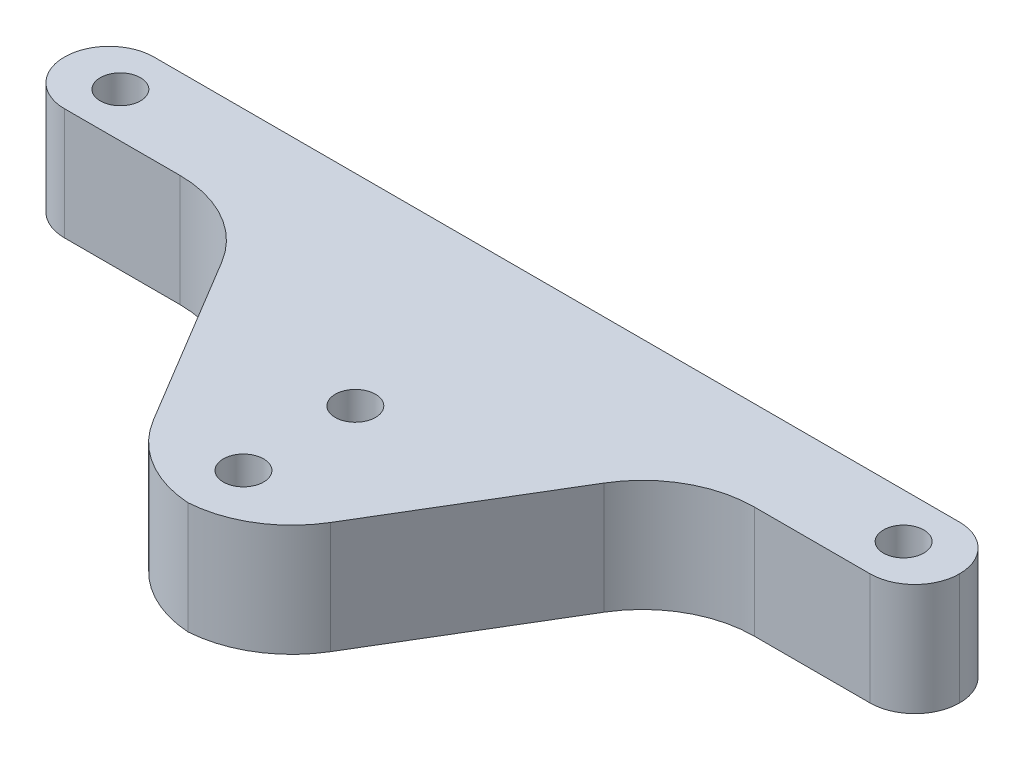
ISO-10303-21;
HEADER;
FILE_DESCRIPTION(('STEP AP214'),'2;1');
FILE_NAME('part.step','',(''),(''),'','','');
FILE_SCHEMA(('AUTOMOTIVE_DESIGN { 1 0 10303 214 1 1 1 1 }'));
ENDSEC;
DATA;
#1=APPLICATION_CONTEXT('core data for automotive mechanical design processes');
#2=APPLICATION_PROTOCOL_DEFINITION('international standard','automotive_design',2000,#1);
#3=PRODUCT_CONTEXT('',#1,'mechanical');
#4=PRODUCT('Part','Part','',(#3));
#5=PRODUCT_RELATED_PRODUCT_CATEGORY('part','',(#4));
#6=PRODUCT_DEFINITION_FORMATION('','',#4);
#7=PRODUCT_DEFINITION_CONTEXT('part definition',#1,'design');
#8=PRODUCT_DEFINITION('design','',#6,#7);
#9=PRODUCT_DEFINITION_SHAPE('','',#8);
#10=(LENGTH_UNIT() NAMED_UNIT(*) SI_UNIT(.MILLI.,.METRE.));
#11=(NAMED_UNIT(*) PLANE_ANGLE_UNIT() SI_UNIT($,.RADIAN.));
#12=(NAMED_UNIT(*) SI_UNIT($,.STERADIAN.) SOLID_ANGLE_UNIT());
#13=UNCERTAINTY_MEASURE_WITH_UNIT(LENGTH_MEASURE(1.E-05),#10,'distance_accuracy_value','');
#14=(GEOMETRIC_REPRESENTATION_CONTEXT(3) GLOBAL_UNCERTAINTY_ASSIGNED_CONTEXT((#13)) GLOBAL_UNIT_ASSIGNED_CONTEXT((#10,
#11,#12)) REPRESENTATION_CONTEXT('',''));
#15=CARTESIAN_POINT('',(0.,0.,0.));
#16=DIRECTION('',(0.,0.,1.));
#17=DIRECTION('',(1.,0.,0.));
#18=AXIS2_PLACEMENT_3D('',#15,#16,#17);
#19=CARTESIAN_POINT('',(0.,12.7,0.));
#20=DIRECTION('',(0.,1.,0.));
#21=DIRECTION('',(0.,0.,1.));
#22=AXIS2_PLACEMENT_3D('',#19,#20,#21);
#23=PLANE('',#22);
#24=CARTESIAN_POINT('',(44.45,12.7,-36.83));
#25=DIRECTION('',(0.,1.,0.));
#26=DIRECTION('',(0.,0.,1.));
#27=AXIS2_PLACEMENT_3D('',#24,#25,#26);
#28=CIRCLE('',#27,2.28599999999999);
#29=CARTESIAN_POINT('',(44.45,12.7,-34.544));
#30=VERTEX_POINT('',#29);
#31=EDGE_CURVE('E492',#30,#30,#28,.T.);
#32=ORIENTED_EDGE('',*,*,#31,.F.);
#33=EDGE_LOOP('',(#32));
#34=FACE_BOUND('',#33,.T.);
#35=CARTESIAN_POINT('',(0.,12.7,-19.05));
#36=DIRECTION('',(0.,1.,0.));
#37=DIRECTION('',(0.,0.,1.));
#38=AXIS2_PLACEMENT_3D('',#35,#36,#37);
#39=CIRCLE('',#38,2.286);
#40=CARTESIAN_POINT('',(0.,12.7,-16.764));
#41=VERTEX_POINT('',#40);
#42=EDGE_CURVE('E271',#41,#41,#39,.T.);
#43=ORIENTED_EDGE('',*,*,#42,.F.);
#44=EDGE_LOOP('',(#43));
#45=FACE_BOUND('',#44,.T.);
#46=DIRECTION('',(0.514495755427526,0.,0.857492925712544));
#47=VECTOR('',#46,1.);
#48=CARTESIAN_POINT('',(-6.35,12.7,0.));
#49=LINE('',#48,#47);
#50=CARTESIAN_POINT('',(-21.7004576563577,12.7,-25.5840960939296));
#51=VERTEX_POINT('',#50);
#52=CARTESIAN_POINT('',(-10.0495423436422,12.7,-6.16590390607043));
#53=VERTEX_POINT('',#52);
#54=EDGE_CURVE('E187',#51,#53,#49,.T.);
#55=ORIENTED_EDGE('',*,*,#54,.T.);
#56=CARTESIAN_POINT('',(0.840617812907077,12.7,-12.7));
#57=DIRECTION('',(0.,1.,0.));
#58=DIRECTION('',(0.,0.,1.));
#59=AXIS2_PLACEMENT_3D('',#56,#57,#58);
#60=CIRCLE('',#59,12.7);
#61=CARTESIAN_POINT('',(0.,12.7,-0.0278509441917086));
#62=VERTEX_POINT('',#61);
#63=EDGE_CURVE('E59',#53,#62,#60,.T.);
#64=ORIENTED_EDGE('',*,*,#63,.T.);
#65=CARTESIAN_POINT('',(-0.840617812907058,12.7,-12.7));
#66=DIRECTION('',(0.,1.,0.));
#67=DIRECTION('',(0.,0.,1.));
#68=AXIS2_PLACEMENT_3D('',#65,#66,#67);
#69=CIRCLE('',#68,12.7);
#70=CARTESIAN_POINT('',(10.0495423436423,12.7,-6.16590390607044));
#71=VERTEX_POINT('',#70);
#72=EDGE_CURVE('E237',#62,#71,#69,.T.);
#73=ORIENTED_EDGE('',*,*,#72,.T.);
#74=DIRECTION('',(0.514495755427526,0.,-0.857492925712544));
#75=VECTOR('',#74,1.);
#76=CARTESIAN_POINT('',(6.35,12.7,0.));
#77=LINE('',#76,#75);
#78=CARTESIAN_POINT('',(21.7004576563577,12.7,-25.5840960939296));
#79=VERTEX_POINT('',#78);
#80=EDGE_CURVE('E185',#71,#79,#77,.T.);
#81=ORIENTED_EDGE('',*,*,#80,.T.);
#82=CARTESIAN_POINT('',(32.5906178129071,12.7,-19.05));
#83=DIRECTION('',(0.,1.,0.));
#84=DIRECTION('',(0.,0.,1.));
#85=AXIS2_PLACEMENT_3D('',#82,#83,#84);
#86=CIRCLE('',#85,12.7);
#87=CARTESIAN_POINT('',(32.5906178129071,12.7,-31.75));
#88=VERTEX_POINT('',#87);
#89=EDGE_CURVE('E11',#79,#88,#86,.F.);
#90=ORIENTED_EDGE('',*,*,#89,.T.);
#91=DIRECTION('',(1.,0.,0.));
#92=VECTOR('',#91,1.);
#93=CARTESIAN_POINT('',(25.4,12.7,-31.75));
#94=LINE('',#93,#92);
#95=CARTESIAN_POINT('',(45.72,12.7,-31.75));
#96=VERTEX_POINT('',#95);
#97=EDGE_CURVE('E274',#88,#96,#94,.T.);
#98=ORIENTED_EDGE('',*,*,#97,.T.);
#99=CARTESIAN_POINT('',(45.72,12.7,-36.83));
#100=DIRECTION('',(0.,1.,0.));
#101=DIRECTION('',(0.,0.,1.));
#102=AXIS2_PLACEMENT_3D('',#99,#100,#101);
#103=CIRCLE('',#102,5.08);
#104=CARTESIAN_POINT('',(50.8,12.7,-36.83));
#105=VERTEX_POINT('',#104);
#106=EDGE_CURVE('E200',#96,#105,#103,.T.);
#107=ORIENTED_EDGE('',*,*,#106,.T.);
#108=CARTESIAN_POINT('',(45.72,12.7,-36.83));
#109=DIRECTION('',(0.,1.,0.));
#110=DIRECTION('',(0.,0.,1.));
#111=AXIS2_PLACEMENT_3D('',#108,#109,#110);
#112=CIRCLE('',#111,5.08);
#113=CARTESIAN_POINT('',(45.72,12.7,-41.91));
#114=VERTEX_POINT('',#113);
#115=EDGE_CURVE('E203',#105,#114,#112,.T.);
#116=ORIENTED_EDGE('',*,*,#115,.T.);
#117=DIRECTION('',(-1.,0.,0.));
#118=VECTOR('',#117,1.);
#119=CARTESIAN_POINT('',(50.8,12.7,-41.91));
#120=LINE('',#119,#118);
#121=CARTESIAN_POINT('',(-45.72,12.7,-41.91));
#122=VERTEX_POINT('',#121);
#123=EDGE_CURVE('E160',#114,#122,#120,.T.);
#124=ORIENTED_EDGE('',*,*,#123,.T.);
#125=CARTESIAN_POINT('',(-45.72,12.7,-36.83));
#126=DIRECTION('',(0.,1.,0.));
#127=DIRECTION('',(0.,0.,1.));
#128=AXIS2_PLACEMENT_3D('',#125,#126,#127);
#129=CIRCLE('',#128,5.08);
#130=CARTESIAN_POINT('',(-50.8,12.7,-36.83));
#131=VERTEX_POINT('',#130);
#132=EDGE_CURVE('E197',#122,#131,#129,.T.);
#133=ORIENTED_EDGE('',*,*,#132,.T.);
#134=CARTESIAN_POINT('',(-45.72,12.7,-36.83));
#135=DIRECTION('',(0.,1.,0.));
#136=DIRECTION('',(0.,0.,1.));
#137=AXIS2_PLACEMENT_3D('',#134,#135,#136);
#138=CIRCLE('',#137,5.08);
#139=CARTESIAN_POINT('',(-45.72,12.7,-31.75));
#140=VERTEX_POINT('',#139);
#141=EDGE_CURVE('E149',#131,#140,#138,.T.);
#142=ORIENTED_EDGE('',*,*,#141,.T.);
#143=DIRECTION('',(1.,0.,0.));
#144=VECTOR('',#143,1.);
#145=CARTESIAN_POINT('',(-25.4,12.7,-31.75));
#146=LINE('',#145,#144);
#147=CARTESIAN_POINT('',(-32.5906178129071,12.7,-31.75));
#148=VERTEX_POINT('',#147);
#149=EDGE_CURVE('E281',#140,#148,#146,.T.);
#150=ORIENTED_EDGE('',*,*,#149,.T.);
#151=CARTESIAN_POINT('',(-32.590617812907,12.7,-19.05));
#152=DIRECTION('',(0.,1.,0.));
#153=DIRECTION('',(0.,0.,1.));
#154=AXIS2_PLACEMENT_3D('',#151,#152,#153);
#155=CIRCLE('',#154,12.7);
#156=EDGE_CURVE('E255',#148,#51,#155,.F.);
#157=ORIENTED_EDGE('',*,*,#156,.T.);
#158=EDGE_LOOP('',(#55,#64,#73,#81,#90,#98,#107,#116,#124,#133,#142,#150,#157));
#159=FACE_BOUND('',#158,.T.);
#160=CARTESIAN_POINT('',(0.,12.7,-6.35000000000003));
#161=DIRECTION('',(0.,1.,0.));
#162=DIRECTION('',(0.,0.,1.));
#163=AXIS2_PLACEMENT_3D('',#160,#161,#162);
#164=CIRCLE('',#163,2.286);
#165=CARTESIAN_POINT('',(0.,12.7,-4.06400000000003));
#166=VERTEX_POINT('',#165);
#167=EDGE_CURVE('E500',#166,#166,#164,.T.);
#168=ORIENTED_EDGE('',*,*,#167,.F.);
#169=EDGE_LOOP('',(#168));
#170=FACE_BOUND('',#169,.T.);
#171=CARTESIAN_POINT('',(-44.45,12.7,-36.83));
#172=DIRECTION('',(0.,1.,0.));
#173=DIRECTION('',(0.,0.,-1.));
#174=AXIS2_PLACEMENT_3D('',#171,#172,#173);
#175=CIRCLE('',#174,2.28599999999999);
#176=CARTESIAN_POINT('',(-44.45,12.7,-39.116));
#177=VERTEX_POINT('',#176);
#178=EDGE_CURVE('E484',#177,#177,#175,.T.);
#179=ORIENTED_EDGE('',*,*,#178,.F.);
#180=EDGE_LOOP('',(#179));
#181=FACE_BOUND('',#180,.T.);
#182=ADVANCED_FACE('F42',(#34,#45,#159,#170,#181),#23,.T.);
#183=CARTESIAN_POINT('',(0.,0.,0.));
#184=DIRECTION('',(0.,1.,0.));
#185=DIRECTION('',(0.,0.,1.));
#186=AXIS2_PLACEMENT_3D('',#183,#184,#185);
#187=PLANE('',#186);
#188=CARTESIAN_POINT('',(-0.840617812907058,0.,-12.7));
#189=DIRECTION('',(0.,1.,0.));
#190=DIRECTION('',(0.,0.,1.));
#191=AXIS2_PLACEMENT_3D('',#188,#189,#190);
#192=CIRCLE('',#191,12.7);
#193=CARTESIAN_POINT('',(10.0495423436423,0.,-6.16590390607044));
#194=VERTEX_POINT('',#193);
#195=CARTESIAN_POINT('',(0.,0.,-0.0278509441917086));
#196=VERTEX_POINT('',#195);
#197=EDGE_CURVE('E231',#194,#196,#192,.F.);
#198=ORIENTED_EDGE('',*,*,#197,.T.);
#199=CARTESIAN_POINT('',(0.840617812907077,0.,-12.7));
#200=DIRECTION('',(0.,1.,0.));
#201=DIRECTION('',(0.,0.,1.));
#202=AXIS2_PLACEMENT_3D('',#199,#200,#201);
#203=CIRCLE('',#202,12.7);
#204=CARTESIAN_POINT('',(-10.0495423436422,0.,-6.16590390607043));
#205=VERTEX_POINT('',#204);
#206=EDGE_CURVE('E234',#196,#205,#203,.F.);
#207=ORIENTED_EDGE('',*,*,#206,.T.);
#208=DIRECTION('',(0.514495755427526,0.,0.857492925712544));
#209=VECTOR('',#208,1.);
#210=CARTESIAN_POINT('',(-6.35,0.,0.));
#211=LINE('',#210,#209);
#212=CARTESIAN_POINT('',(-21.7004576563577,0.,-25.5840960939296));
#213=VERTEX_POINT('',#212);
#214=EDGE_CURVE('E176',#213,#205,#211,.T.);
#215=ORIENTED_EDGE('',*,*,#214,.F.);
#216=CARTESIAN_POINT('',(-32.590617812907,0.,-19.05));
#217=DIRECTION('',(0.,1.,0.));
#218=DIRECTION('',(0.,0.,1.));
#219=AXIS2_PLACEMENT_3D('',#216,#217,#218);
#220=CIRCLE('',#219,12.7);
#221=CARTESIAN_POINT('',(-32.5906178129071,0.,-31.75));
#222=VERTEX_POINT('',#221);
#223=EDGE_CURVE('E252',#213,#222,#220,.T.);
#224=ORIENTED_EDGE('',*,*,#223,.T.);
#225=DIRECTION('',(1.,0.,0.));
#226=VECTOR('',#225,1.);
#227=CARTESIAN_POINT('',(-25.4,0.,-31.75));
#228=LINE('',#227,#226);
#229=CARTESIAN_POINT('',(-45.72,0.,-31.75));
#230=VERTEX_POINT('',#229);
#231=EDGE_CURVE('E170',#230,#222,#228,.T.);
#232=ORIENTED_EDGE('',*,*,#231,.F.);
#233=CARTESIAN_POINT('',(-45.72,0.,-36.83));
#234=DIRECTION('',(0.,1.,0.));
#235=DIRECTION('',(0.,0.,1.));
#236=AXIS2_PLACEMENT_3D('',#233,#234,#235);
#237=CIRCLE('',#236,5.08);
#238=CARTESIAN_POINT('',(-50.8,0.,-36.83));
#239=VERTEX_POINT('',#238);
#240=EDGE_CURVE('E162',#230,#239,#237,.F.);
#241=ORIENTED_EDGE('',*,*,#240,.T.);
#242=CARTESIAN_POINT('',(-45.72,0.,-36.83));
#243=DIRECTION('',(0.,1.,0.));
#244=DIRECTION('',(0.,0.,1.));
#245=AXIS2_PLACEMENT_3D('',#242,#243,#244);
#246=CIRCLE('',#245,5.08);
#247=CARTESIAN_POINT('',(-45.72,0.,-41.91));
#248=VERTEX_POINT('',#247);
#249=EDGE_CURVE('E168',#239,#248,#246,.F.);
#250=ORIENTED_EDGE('',*,*,#249,.T.);
#251=DIRECTION('',(-1.,0.,0.));
#252=VECTOR('',#251,1.);
#253=CARTESIAN_POINT('',(50.8,0.,-41.91));
#254=LINE('',#253,#252);
#255=CARTESIAN_POINT('',(45.72,0.,-41.91));
#256=VERTEX_POINT('',#255);
#257=EDGE_CURVE('E157',#256,#248,#254,.T.);
#258=ORIENTED_EDGE('',*,*,#257,.F.);
#259=CARTESIAN_POINT('',(45.72,0.,-36.83));
#260=DIRECTION('',(0.,1.,0.));
#261=DIRECTION('',(0.,0.,1.));
#262=AXIS2_PLACEMENT_3D('',#259,#260,#261);
#263=CIRCLE('',#262,5.08);
#264=CARTESIAN_POINT('',(50.8,0.,-36.83));
#265=VERTEX_POINT('',#264);
#266=EDGE_CURVE('E137',#256,#265,#263,.F.);
#267=ORIENTED_EDGE('',*,*,#266,.T.);
#268=CARTESIAN_POINT('',(45.72,0.,-36.83));
#269=DIRECTION('',(0.,1.,0.));
#270=DIRECTION('',(0.,0.,1.));
#271=AXIS2_PLACEMENT_3D('',#268,#269,#270);
#272=CIRCLE('',#271,5.08);
#273=CARTESIAN_POINT('',(45.72,0.,-31.75));
#274=VERTEX_POINT('',#273);
#275=EDGE_CURVE('E150',#265,#274,#272,.F.);
#276=ORIENTED_EDGE('',*,*,#275,.T.);
#277=DIRECTION('',(1.,0.,0.));
#278=VECTOR('',#277,1.);
#279=CARTESIAN_POINT('',(25.4,0.,-31.75));
#280=LINE('',#279,#278);
#281=CARTESIAN_POINT('',(32.5906178129071,0.,-31.75));
#282=VERTEX_POINT('',#281);
#283=EDGE_CURVE('E171',#282,#274,#280,.T.);
#284=ORIENTED_EDGE('',*,*,#283,.F.);
#285=CARTESIAN_POINT('',(32.5906178129071,0.,-19.05));
#286=DIRECTION('',(0.,1.,0.));
#287=DIRECTION('',(0.,0.,1.));
#288=AXIS2_PLACEMENT_3D('',#285,#286,#287);
#289=CIRCLE('',#288,12.7);
#290=CARTESIAN_POINT('',(21.7004576563577,0.,-25.5840960939296));
#291=VERTEX_POINT('',#290);
#292=EDGE_CURVE('E52',#282,#291,#289,.T.);
#293=ORIENTED_EDGE('',*,*,#292,.T.);
#294=DIRECTION('',(0.514495755427526,0.,-0.857492925712544));
#295=VECTOR('',#294,1.);
#296=CARTESIAN_POINT('',(6.35,0.,0.));
#297=LINE('',#296,#295);
#298=EDGE_CURVE('E178',#194,#291,#297,.T.);
#299=ORIENTED_EDGE('',*,*,#298,.F.);
#300=EDGE_LOOP('',(#198,#207,#215,#224,#232,#241,#250,#258,#267,#276,#284,#293,#299));
#301=FACE_BOUND('',#300,.T.);
#302=CARTESIAN_POINT('',(0.,0.,-19.05));
#303=DIRECTION('',(0.,1.,0.));
#304=DIRECTION('',(0.,0.,1.));
#305=AXIS2_PLACEMENT_3D('',#302,#303,#304);
#306=CIRCLE('',#305,2.286);
#307=CARTESIAN_POINT('',(0.,0.,-16.764));
#308=VERTEX_POINT('',#307);
#309=EDGE_CURVE('E504',#308,#308,#306,.T.);
#310=ORIENTED_EDGE('',*,*,#309,.T.);
#311=EDGE_LOOP('',(#310));
#312=FACE_BOUND('',#311,.T.);
#313=CARTESIAN_POINT('',(0.,0.,-6.35000000000003));
#314=DIRECTION('',(0.,1.,0.));
#315=DIRECTION('',(0.,0.,1.));
#316=AXIS2_PLACEMENT_3D('',#313,#314,#315);
#317=CIRCLE('',#316,2.286);
#318=CARTESIAN_POINT('',(0.,0.,-4.06400000000003));
#319=VERTEX_POINT('',#318);
#320=EDGE_CURVE('E496',#319,#319,#317,.T.);
#321=ORIENTED_EDGE('',*,*,#320,.T.);
#322=EDGE_LOOP('',(#321));
#323=FACE_BOUND('',#322,.T.);
#324=CARTESIAN_POINT('',(44.45,0.,-36.83));
#325=DIRECTION('',(0.,1.,0.));
#326=DIRECTION('',(0.,0.,1.));
#327=AXIS2_PLACEMENT_3D('',#324,#325,#326);
#328=CIRCLE('',#327,2.28599999999999);
#329=CARTESIAN_POINT('',(44.45,0.,-34.544));
#330=VERTEX_POINT('',#329);
#331=EDGE_CURVE('E488',#330,#330,#328,.T.);
#332=ORIENTED_EDGE('',*,*,#331,.T.);
#333=EDGE_LOOP('',(#332));
#334=FACE_BOUND('',#333,.T.);
#335=CARTESIAN_POINT('',(-44.45,0.,-36.83));
#336=DIRECTION('',(0.,1.,0.));
#337=DIRECTION('',(0.,0.,-1.));
#338=AXIS2_PLACEMENT_3D('',#335,#336,#337);
#339=CIRCLE('',#338,2.28599999999999);
#340=CARTESIAN_POINT('',(-44.45,0.,-39.116));
#341=VERTEX_POINT('',#340);
#342=EDGE_CURVE('E216',#341,#341,#339,.T.);
#343=ORIENTED_EDGE('',*,*,#342,.T.);
#344=EDGE_LOOP('',(#343));
#345=FACE_BOUND('',#344,.T.);
#346=ADVANCED_FACE('F165',(#301,#312,#323,#334,#345),#187,.F.);
#347=CARTESIAN_POINT('',(6.35,12.7,0.));
#348=DIRECTION('',(-0.857492925712544,0.,-0.514495755427526));
#349=DIRECTION('',(-0.514495755427526,0.,0.857492925712545));
#350=AXIS2_PLACEMENT_3D('',#347,#348,#349);
#351=PLANE('',#350);
#352=ORIENTED_EDGE('',*,*,#80,.F.);
#353=DIRECTION('',(0.,-1.,0.));
#354=VECTOR('',#353,1.);
#355=CARTESIAN_POINT('',(10.0495423436423,12.7,-6.16590390607044));
#356=LINE('',#355,#354);
#357=EDGE_CURVE('E245',#71,#194,#356,.T.);
#358=ORIENTED_EDGE('',*,*,#357,.T.);
#359=ORIENTED_EDGE('',*,*,#298,.T.);
#360=DIRECTION('',(0.,-1.,0.));
#361=VECTOR('',#360,1.);
#362=CARTESIAN_POINT('',(21.7004576563577,12.7,-25.5840960939296));
#363=LINE('',#362,#361);
#364=EDGE_CURVE('E242',#291,#79,#363,.F.);
#365=ORIENTED_EDGE('',*,*,#364,.T.);
#366=EDGE_LOOP('',(#352,#358,#359,#365));
#367=FACE_BOUND('',#366,.T.);
#368=ADVANCED_FACE('F268',(#367),#351,.F.);
#369=CARTESIAN_POINT('',(25.4,12.7,-31.75));
#370=DIRECTION('',(0.,0.,-1.));
#371=DIRECTION('',(-1.,0.,0.));
#372=AXIS2_PLACEMENT_3D('',#369,#370,#371);
#373=PLANE('',#372);
#374=ORIENTED_EDGE('',*,*,#97,.F.);
#375=DIRECTION('',(0.,-1.,0.));
#376=VECTOR('',#375,1.);
#377=CARTESIAN_POINT('',(32.5906178129071,0.,-31.75));
#378=LINE('',#377,#376);
#379=EDGE_CURVE('E248',#88,#282,#378,.T.);
#380=ORIENTED_EDGE('',*,*,#379,.T.);
#381=ORIENTED_EDGE('',*,*,#283,.T.);
#382=DIRECTION('',(0.,-1.,0.));
#383=VECTOR('',#382,1.);
#384=CARTESIAN_POINT('',(45.72,12.7,-31.75));
#385=LINE('',#384,#383);
#386=EDGE_CURVE('E206',#274,#96,#385,.F.);
#387=ORIENTED_EDGE('',*,*,#386,.T.);
#388=EDGE_LOOP('',(#374,#380,#381,#387));
#389=FACE_BOUND('',#388,.T.);
#390=ADVANCED_FACE('F273',(#389),#373,.F.);
#391=CARTESIAN_POINT('',(50.8,12.7,-41.91));
#392=DIRECTION('',(0.,0.,1.));
#393=DIRECTION('',(1.,0.,0.));
#394=AXIS2_PLACEMENT_3D('',#391,#392,#393);
#395=PLANE('',#394);
#396=ORIENTED_EDGE('',*,*,#123,.F.);
#397=DIRECTION('',(0.,-1.,0.));
#398=VECTOR('',#397,1.);
#399=CARTESIAN_POINT('',(45.72,12.7,-41.91));
#400=LINE('',#399,#398);
#401=EDGE_CURVE('E141',#114,#256,#400,.T.);
#402=ORIENTED_EDGE('',*,*,#401,.T.);
#403=ORIENTED_EDGE('',*,*,#257,.T.);
#404=DIRECTION('',(0.,-1.,0.));
#405=VECTOR('',#404,1.);
#406=CARTESIAN_POINT('',(-45.72,12.7,-41.91));
#407=LINE('',#406,#405);
#408=EDGE_CURVE('E163',#248,#122,#407,.F.);
#409=ORIENTED_EDGE('',*,*,#408,.T.);
#410=EDGE_LOOP('',(#396,#402,#403,#409));
#411=FACE_BOUND('',#410,.T.);
#412=ADVANCED_FACE('F155',(#411),#395,.F.);
#413=CARTESIAN_POINT('',(-25.4,12.7,-31.75));
#414=DIRECTION('',(0.,0.,-1.));
#415=DIRECTION('',(-1.,0.,0.));
#416=AXIS2_PLACEMENT_3D('',#413,#414,#415);
#417=PLANE('',#416);
#418=ORIENTED_EDGE('',*,*,#231,.T.);
#419=DIRECTION('',(0.,-1.,0.));
#420=VECTOR('',#419,1.);
#421=CARTESIAN_POINT('',(-32.5906178129071,12.7,-31.75));
#422=LINE('',#421,#420);
#423=EDGE_CURVE('E228',#222,#148,#422,.F.);
#424=ORIENTED_EDGE('',*,*,#423,.T.);
#425=ORIENTED_EDGE('',*,*,#149,.F.);
#426=DIRECTION('',(0.,-1.,0.));
#427=VECTOR('',#426,1.);
#428=CARTESIAN_POINT('',(-45.72,12.7,-31.75));
#429=LINE('',#428,#427);
#430=EDGE_CURVE('E210',#140,#230,#429,.T.);
#431=ORIENTED_EDGE('',*,*,#430,.T.);
#432=EDGE_LOOP('',(#418,#424,#425,#431));
#433=FACE_BOUND('',#432,.T.);
#434=ADVANCED_FACE('F304',(#433),#417,.F.);
#435=CARTESIAN_POINT('',(-6.35,12.7,0.));
#436=DIRECTION('',(0.857492925712544,0.,-0.514495755427526));
#437=DIRECTION('',(-0.514495755427526,0.,-0.857492925712544));
#438=AXIS2_PLACEMENT_3D('',#435,#436,#437);
#439=PLANE('',#438);
#440=ORIENTED_EDGE('',*,*,#54,.F.);
#441=DIRECTION('',(0.,-1.,0.));
#442=VECTOR('',#441,1.);
#443=CARTESIAN_POINT('',(-21.7004576563577,0.,-25.5840960939296));
#444=LINE('',#443,#442);
#445=EDGE_CURVE('E224',#51,#213,#444,.T.);
#446=ORIENTED_EDGE('',*,*,#445,.T.);
#447=ORIENTED_EDGE('',*,*,#214,.T.);
#448=DIRECTION('',(0.,-1.,0.));
#449=VECTOR('',#448,1.);
#450=CARTESIAN_POINT('',(-10.0495423436422,12.7,-6.16590390607043));
#451=LINE('',#450,#449);
#452=EDGE_CURVE('E213',#205,#53,#451,.F.);
#453=ORIENTED_EDGE('',*,*,#452,.T.);
#454=EDGE_LOOP('',(#440,#446,#447,#453));
#455=FACE_BOUND('',#454,.T.);
#456=ADVANCED_FACE('F295',(#455),#439,.F.);
#457=CARTESIAN_POINT('',(0.,12.7,-19.05));
#458=DIRECTION('',(0.,-1.,0.));
#459=DIRECTION('',(0.,0.,-1.));
#460=AXIS2_PLACEMENT_3D('',#457,#458,#459);
#461=CYLINDRICAL_SURFACE('',#460,2.286);
#462=ORIENTED_EDGE('',*,*,#42,.T.);
#463=EDGE_LOOP('',(#462));
#464=FACE_BOUND('',#463,.T.);
#465=ORIENTED_EDGE('',*,*,#309,.F.);
#466=EDGE_LOOP('',(#465));
#467=FACE_BOUND('',#466,.T.);
#468=ADVANCED_FACE('F337',(#464,#467),#461,.F.);
#469=CARTESIAN_POINT('',(0.,12.7,-6.35000000000003));
#470=DIRECTION('',(0.,-1.,0.));
#471=DIRECTION('',(0.,0.,-1.));
#472=AXIS2_PLACEMENT_3D('',#469,#470,#471);
#473=CYLINDRICAL_SURFACE('',#472,2.286);
#474=ORIENTED_EDGE('',*,*,#167,.T.);
#475=EDGE_LOOP('',(#474));
#476=FACE_BOUND('',#475,.T.);
#477=ORIENTED_EDGE('',*,*,#320,.F.);
#478=EDGE_LOOP('',(#477));
#479=FACE_BOUND('',#478,.T.);
#480=ADVANCED_FACE('F377',(#476,#479),#473,.F.);
#481=CARTESIAN_POINT('',(44.45,12.7,-36.83));
#482=DIRECTION('',(0.,-1.,0.));
#483=DIRECTION('',(0.,0.,-1.));
#484=AXIS2_PLACEMENT_3D('',#481,#482,#483);
#485=CYLINDRICAL_SURFACE('',#484,2.28599999999999);
#486=ORIENTED_EDGE('',*,*,#31,.T.);
#487=EDGE_LOOP('',(#486));
#488=FACE_BOUND('',#487,.T.);
#489=ORIENTED_EDGE('',*,*,#331,.F.);
#490=EDGE_LOOP('',(#489));
#491=FACE_BOUND('',#490,.T.);
#492=ADVANCED_FACE('F323',(#488,#491),#485,.F.);
#493=CARTESIAN_POINT('',(-44.45,12.7,-36.83));
#494=DIRECTION('',(0.,-1.,0.));
#495=DIRECTION('',(0.,0.,-1.));
#496=AXIS2_PLACEMENT_3D('',#493,#494,#495);
#497=CYLINDRICAL_SURFACE('',#496,2.28599999999999);
#498=ORIENTED_EDGE('',*,*,#178,.T.);
#499=EDGE_LOOP('',(#498));
#500=FACE_BOUND('',#499,.T.);
#501=ORIENTED_EDGE('',*,*,#342,.F.);
#502=EDGE_LOOP('',(#501));
#503=FACE_BOUND('',#502,.T.);
#504=ADVANCED_FACE('F316',(#500,#503),#497,.F.);
#505=CARTESIAN_POINT('',(45.72,12.7,-36.83));
#506=DIRECTION('',(0.,-1.,0.));
#507=DIRECTION('',(0.,0.,-1.));
#508=AXIS2_PLACEMENT_3D('',#505,#506,#507);
#509=CYLINDRICAL_SURFACE('',#508,5.08);
#510=DIRECTION('',(0.,-1.,0.));
#511=VECTOR('',#510,1.);
#512=CARTESIAN_POINT('',(50.8,12.7,-36.83));
#513=LINE('',#512,#511);
#514=EDGE_CURVE('E143',#105,#265,#513,.T.);
#515=ORIENTED_EDGE('',*,*,#514,.F.);
#516=ORIENTED_EDGE('',*,*,#106,.F.);
#517=ORIENTED_EDGE('',*,*,#386,.F.);
#518=ORIENTED_EDGE('',*,*,#275,.F.);
#519=EDGE_LOOP('',(#515,#516,#517,#518));
#520=FACE_BOUND('',#519,.T.);
#521=ADVANCED_FACE('F314',(#520),#509,.T.);
#522=CARTESIAN_POINT('',(45.72,12.7,-36.83));
#523=DIRECTION('',(0.,-1.,0.));
#524=DIRECTION('',(0.,0.,-1.));
#525=AXIS2_PLACEMENT_3D('',#522,#523,#524);
#526=CYLINDRICAL_SURFACE('',#525,5.08);
#527=ORIENTED_EDGE('',*,*,#115,.F.);
#528=ORIENTED_EDGE('',*,*,#514,.T.);
#529=ORIENTED_EDGE('',*,*,#266,.F.);
#530=ORIENTED_EDGE('',*,*,#401,.F.);
#531=EDGE_LOOP('',(#527,#528,#529,#530));
#532=FACE_BOUND('',#531,.T.);
#533=ADVANCED_FACE('F140',(#532),#526,.T.);
#534=CARTESIAN_POINT('',(-45.72,12.7,-36.83));
#535=DIRECTION('',(0.,-1.,0.));
#536=DIRECTION('',(0.,0.,-1.));
#537=AXIS2_PLACEMENT_3D('',#534,#535,#536);
#538=CYLINDRICAL_SURFACE('',#537,5.08);
#539=ORIENTED_EDGE('',*,*,#430,.F.);
#540=ORIENTED_EDGE('',*,*,#141,.F.);
#541=DIRECTION('',(0.,-1.,0.));
#542=VECTOR('',#541,1.);
#543=CARTESIAN_POINT('',(-50.8,12.7,-36.83));
#544=LINE('',#543,#542);
#545=EDGE_CURVE('E217',#239,#131,#544,.F.);
#546=ORIENTED_EDGE('',*,*,#545,.F.);
#547=ORIENTED_EDGE('',*,*,#240,.F.);
#548=EDGE_LOOP('',(#539,#540,#546,#547));
#549=FACE_BOUND('',#548,.T.);
#550=ADVANCED_FACE('F309',(#549),#538,.T.);
#551=CARTESIAN_POINT('',(-45.72,12.7,-36.83));
#552=DIRECTION('',(0.,-1.,0.));
#553=DIRECTION('',(0.,0.,-1.));
#554=AXIS2_PLACEMENT_3D('',#551,#552,#553);
#555=CYLINDRICAL_SURFACE('',#554,5.08);
#556=ORIENTED_EDGE('',*,*,#132,.F.);
#557=ORIENTED_EDGE('',*,*,#408,.F.);
#558=ORIENTED_EDGE('',*,*,#249,.F.);
#559=ORIENTED_EDGE('',*,*,#545,.T.);
#560=EDGE_LOOP('',(#556,#557,#558,#559));
#561=FACE_BOUND('',#560,.T.);
#562=ADVANCED_FACE('F312',(#561),#555,.T.);
#563=CARTESIAN_POINT('',(-32.590617812907,12.7,-19.05));
#564=DIRECTION('',(0.,1.,0.));
#565=DIRECTION('',(0.,0.,1.));
#566=AXIS2_PLACEMENT_3D('',#563,#564,#565);
#567=CYLINDRICAL_SURFACE('',#566,12.7);
#568=ORIENTED_EDGE('',*,*,#156,.F.);
#569=ORIENTED_EDGE('',*,*,#423,.F.);
#570=ORIENTED_EDGE('',*,*,#223,.F.);
#571=ORIENTED_EDGE('',*,*,#445,.F.);
#572=EDGE_LOOP('',(#568,#569,#570,#571));
#573=FACE_BOUND('',#572,.T.);
#574=ADVANCED_FACE('F299',(#573),#567,.F.);
#575=CARTESIAN_POINT('',(-0.840617812907058,12.7,-12.7));
#576=DIRECTION('',(0.,-1.,0.));
#577=DIRECTION('',(0.,0.,-1.));
#578=AXIS2_PLACEMENT_3D('',#575,#576,#577);
#579=CYLINDRICAL_SURFACE('',#578,12.7);
#580=ORIENTED_EDGE('',*,*,#357,.F.);
#581=ORIENTED_EDGE('',*,*,#72,.F.);
#582=DIRECTION('',(0.,-1.,0.));
#583=VECTOR('',#582,1.);
#584=CARTESIAN_POINT('',(0.,6.35,-0.0278509441917086));
#585=LINE('',#584,#583);
#586=EDGE_CURVE('E46',#196,#62,#585,.F.);
#587=ORIENTED_EDGE('',*,*,#586,.F.);
#588=ORIENTED_EDGE('',*,*,#197,.F.);
#589=EDGE_LOOP('',(#580,#581,#587,#588));
#590=FACE_BOUND('',#589,.T.);
#591=ADVANCED_FACE('F439',(#590),#579,.T.);
#592=CARTESIAN_POINT('',(0.840617812907077,12.7,-12.7));
#593=DIRECTION('',(0.,-1.,0.));
#594=DIRECTION('',(0.,0.,-1.));
#595=AXIS2_PLACEMENT_3D('',#592,#593,#594);
#596=CYLINDRICAL_SURFACE('',#595,12.7);
#597=ORIENTED_EDGE('',*,*,#63,.F.);
#598=ORIENTED_EDGE('',*,*,#452,.F.);
#599=ORIENTED_EDGE('',*,*,#206,.F.);
#600=ORIENTED_EDGE('',*,*,#586,.T.);
#601=EDGE_LOOP('',(#597,#598,#599,#600));
#602=FACE_BOUND('',#601,.T.);
#603=ADVANCED_FACE('F449',(#602),#596,.T.);
#604=CARTESIAN_POINT('',(32.5906178129071,12.7,-19.05));
#605=DIRECTION('',(0.,1.,0.));
#606=DIRECTION('',(0.,0.,1.));
#607=AXIS2_PLACEMENT_3D('',#604,#605,#606);
#608=CYLINDRICAL_SURFACE('',#607,12.7);
#609=ORIENTED_EDGE('',*,*,#89,.F.);
#610=ORIENTED_EDGE('',*,*,#364,.F.);
#611=ORIENTED_EDGE('',*,*,#292,.F.);
#612=ORIENTED_EDGE('',*,*,#379,.F.);
#613=EDGE_LOOP('',(#609,#610,#611,#612));
#614=FACE_BOUND('',#613,.T.);
#615=ADVANCED_FACE('F44',(#614),#608,.F.);
#616=CLOSED_SHELL('',(#182,#346,#368,#390,#412,#434,#456,#468,#480,#492,#504,#521,#533,#550,
#562,#574,#591,#603,#615));
#617=MANIFOLD_SOLID_BREP('B2',#616);
#618=ADVANCED_BREP_SHAPE_REPRESENTATION('',(#18,#617),#14);
#619=SHAPE_DEFINITION_REPRESENTATION(#9,#618);
ENDSEC;
END-ISO-10303-21;
